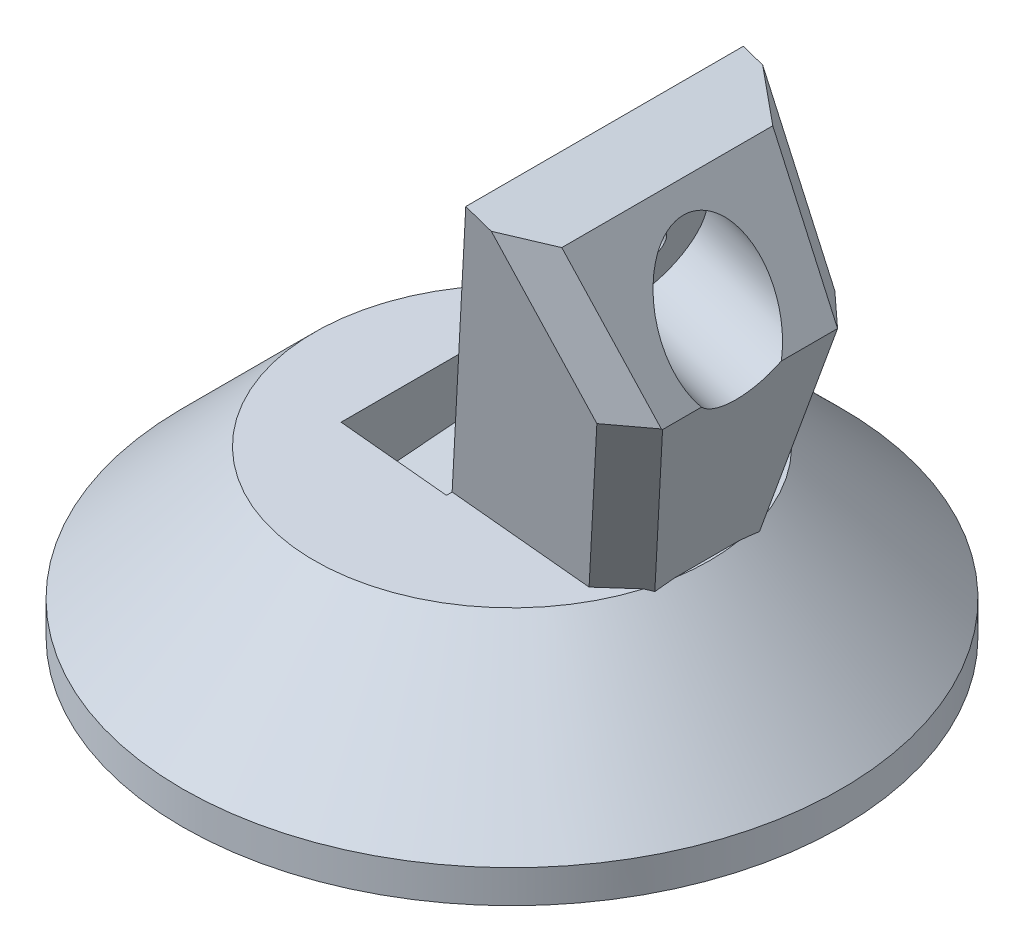
ISO-10303-21;
HEADER;
FILE_DESCRIPTION(('STEP AP214'),'2;1');
FILE_NAME('part.step','',(''),(''),'','','');
FILE_SCHEMA(('AUTOMOTIVE_DESIGN { 1 0 10303 214 1 1 1 1 }'));
ENDSEC;
DATA;
#1=APPLICATION_CONTEXT('core data for automotive mechanical design processes');
#2=APPLICATION_PROTOCOL_DEFINITION('international standard','automotive_design',2000,#1);
#3=PRODUCT_CONTEXT('',#1,'mechanical');
#4=PRODUCT('Part','Part','',(#3));
#5=PRODUCT_RELATED_PRODUCT_CATEGORY('part','',(#4));
#6=PRODUCT_DEFINITION_FORMATION('','',#4);
#7=PRODUCT_DEFINITION_CONTEXT('part definition',#1,'design');
#8=PRODUCT_DEFINITION('design','',#6,#7);
#9=PRODUCT_DEFINITION_SHAPE('','',#8);
#10=(LENGTH_UNIT() NAMED_UNIT(*) SI_UNIT(.MILLI.,.METRE.));
#11=(NAMED_UNIT(*) PLANE_ANGLE_UNIT() SI_UNIT($,.RADIAN.));
#12=(NAMED_UNIT(*) SI_UNIT($,.STERADIAN.) SOLID_ANGLE_UNIT());
#13=UNCERTAINTY_MEASURE_WITH_UNIT(LENGTH_MEASURE(1.E-05),#10,'distance_accuracy_value','');
#14=(GEOMETRIC_REPRESENTATION_CONTEXT(3) GLOBAL_UNCERTAINTY_ASSIGNED_CONTEXT((#13)) GLOBAL_UNIT_ASSIGNED_CONTEXT((#10,
#11,#12)) REPRESENTATION_CONTEXT('',''));
#15=CARTESIAN_POINT('',(0.,0.,0.));
#16=DIRECTION('',(0.,0.,1.));
#17=DIRECTION('',(1.,0.,0.));
#18=AXIS2_PLACEMENT_3D('',#15,#16,#17);
#19=CARTESIAN_POINT('',(-27.7596757204934,54.7423370391326,3.17601245662759));
#20=DIRECTION('',(0.946930129495105,-0.321439465303162,0.));
#21=DIRECTION('',(0.321439465303162,0.946930129495106,0.));
#22=AXIS2_PLACEMENT_3D('',#19,#20,#21);
#23=CYLINDRICAL_SURFACE('',#22,1.5);
#24=CARTESIAN_POINT('',(10.0065690125101,41.922424423238,3.17601245662759));
#25=DIRECTION('',(-0.946930129495105,0.321439465303162,0.));
#26=DIRECTION('',(-0.321439465303162,-0.946930129495106,0.));
#27=AXIS2_PLACEMENT_3D('',#24,#25,#26);
#28=CIRCLE('',#27,1.5);
#29=CARTESIAN_POINT('',(9.52440981455531,40.5020292289954,3.17601245662759));
#30=VERTEX_POINT('',#29);
#31=EDGE_CURVE('E415',#30,#30,#28,.T.);
#32=ORIENTED_EDGE('',*,*,#31,.T.);
#33=EDGE_LOOP('',(#32));
#34=FACE_BOUND('',#33,.T.);
#35=CARTESIAN_POINT('',(15.6881497894807,39.993787631419,3.17601245662759));
#36=DIRECTION('',(0.946930129495106,-0.321439465303162,0.));
#37=DIRECTION('',(0.321439465303162,0.946930129495105,0.));
#38=AXIS2_PLACEMENT_3D('',#35,#36,#37);
#39=CIRCLE('',#38,1.5);
#40=CARTESIAN_POINT('',(16.1703089874354,41.4141828256617,3.17601245662759));
#41=VERTEX_POINT('',#40);
#42=EDGE_CURVE('E413',#41,#41,#39,.F.);
#43=ORIENTED_EDGE('',*,*,#42,.F.);
#44=EDGE_LOOP('',(#43));
#45=FACE_BOUND('',#44,.T.);
#46=ADVANCED_FACE('F32',(#34,#45),#23,.F.);
#47=CARTESIAN_POINT('',(-18.,15.,0.));
#48=DIRECTION('',(0.,1.,0.));
#49=DIRECTION('',(0.,0.,1.));
#50=AXIS2_PLACEMENT_3D('',#47,#48,#49);
#51=PLANE('',#50);
#52=DIRECTION('',(-0.999934455038665,0.,0.0114492631434682));
#53=VECTOR('',#52,1.);
#54=CARTESIAN_POINT('',(-18.0856382371058,15.,-7.47931311193634));
#55=LINE('',#54,#53);
#56=CARTESIAN_POINT('',(14.5962110075819,15.,-7.85352073137787));
#57=VERTEX_POINT('',#56);
#58=CARTESIAN_POINT('',(0.867637383114527,15.,-7.69632837620003));
#59=VERTEX_POINT('',#58);
#60=EDGE_CURVE('E163',#57,#59,#55,.T.);
#61=ORIENTED_EDGE('',*,*,#60,.F.);
#62=DIRECTION('',(-0.730054006471106,0.,-0.68338945531482));
#63=VECTOR('',#62,1.);
#64=CARTESIAN_POINT('',(13.9186151586497,15.,-8.4878051185888));
#65=LINE('',#64,#63);
#66=CARTESIAN_POINT('',(17.1513905962115,15.,-5.46166646877923));
#67=VERTEX_POINT('',#66);
#68=EDGE_CURVE('E191',#57,#67,#65,.F.);
#69=ORIENTED_EDGE('',*,*,#68,.T.);
#70=CARTESIAN_POINT('',(0.,15.,0.));
#71=DIRECTION('',(0.,1.,0.));
#72=DIRECTION('',(0.,0.,1.));
#73=AXIS2_PLACEMENT_3D('',#70,#71,#72);
#74=CIRCLE('',#73,18.);
#75=CARTESIAN_POINT('',(17.2219620185472,15.,5.2348853121835));
#76=VERTEX_POINT('',#75);
#77=EDGE_CURVE('E54',#67,#76,#74,.T.);
#78=ORIENTED_EDGE('',*,*,#77,.T.);
#79=DIRECTION('',(0.745897481200364,0.,-0.666060768653246));
#80=VECTOR('',#79,1.);
#81=CARTESIAN_POINT('',(15.7204142178493,15.,6.57571579828868));
#82=LINE('',#81,#80);
#83=CARTESIAN_POINT('',(14.5962110075819,15.,7.57959055752248));
#84=VERTEX_POINT('',#83);
#85=EDGE_CURVE('E41',#76,#84,#82,.F.);
#86=ORIENTED_EDGE('',*,*,#85,.T.);
#87=DIRECTION('',(0.99580121253747,0.,0.0915420401176663));
#88=VECTOR('',#87,1.);
#89=CARTESIAN_POINT('',(-18.4177833902428,15.,4.54467921019736));
#90=LINE('',#89,#88);
#91=CARTESIAN_POINT('',(0.867637383114528,15.,6.31754987945689));
#92=VERTEX_POINT('',#91);
#93=EDGE_CURVE('E350',#92,#84,#90,.T.);
#94=ORIENTED_EDGE('',*,*,#93,.F.);
#95=DIRECTION('',(0.,0.,1.));
#96=VECTOR('',#95,1.);
#97=CARTESIAN_POINT('',(0.867637383114527,15.,0.));
#98=LINE('',#97,#96);
#99=CARTESIAN_POINT('',(0.867637383114526,15.,6.83759542695866));
#100=VERTEX_POINT('',#99);
#101=EDGE_CURVE('E343',#92,#100,#98,.T.);
#102=ORIENTED_EDGE('',*,*,#101,.T.);
#103=DIRECTION('',(0.99580121253747,0.,0.0915420401176663));
#104=VECTOR('',#103,1.);
#105=CARTESIAN_POINT('',(-18.4651895330117,15.,5.06036680455694));
#106=LINE('',#105,#104);
#107=CARTESIAN_POINT('',(-9.69280386647578,15.,5.86679490536974));
#108=VERTEX_POINT('',#107);
#109=EDGE_CURVE('E363',#108,#100,#106,.T.);
#110=ORIENTED_EDGE('',*,*,#109,.F.);
#111=DIRECTION('',(0.,0.,1.));
#112=VECTOR('',#111,1.);
#113=CARTESIAN_POINT('',(-9.69280386647578,15.,0.));
#114=LINE('',#113,#112);
#115=CARTESIAN_POINT('',(-9.69280386647578,15.,-8.09545672741115));
#116=VERTEX_POINT('',#115);
#117=EDGE_CURVE('E357',#116,#108,#114,.T.);
#118=ORIENTED_EDGE('',*,*,#117,.F.);
#119=DIRECTION('',(-0.999934455038665,0.,0.0114492631434682));
#120=VECTOR('',#119,1.);
#121=CARTESIAN_POINT('',(-18.091591985162,15.,-7.99929048894169));
#122=LINE('',#121,#120);
#123=CARTESIAN_POINT('',(0.867637383114527,15.,-8.2163739237018));
#124=VERTEX_POINT('',#123);
#125=EDGE_CURVE('E361',#124,#116,#122,.T.);
#126=ORIENTED_EDGE('',*,*,#125,.F.);
#127=EDGE_CURVE('E347',#124,#59,#98,.T.);
#128=ORIENTED_EDGE('',*,*,#127,.T.);
#129=EDGE_LOOP('',(#61,#69,#78,#86,#94,#102,#110,#118,#126,#128));
#130=FACE_BOUND('',#129,.T.);
#131=ADVANCED_FACE('F278',(#130),#51,.T.);
#132=CARTESIAN_POINT('',(0.,0.,0.));
#133=DIRECTION('',(0.,-1.,0.));
#134=DIRECTION('',(0.,0.,-1.));
#135=AXIS2_PLACEMENT_3D('',#132,#133,#134);
#136=PLANE('',#135);
#137=CARTESIAN_POINT('',(16.,0.,0.));
#138=DIRECTION('',(0.,-1.,0.));
#139=DIRECTION('',(0.,0.,-1.));
#140=AXIS2_PLACEMENT_3D('',#137,#138,#139);
#141=CIRCLE('',#140,1.75);
#142=CARTESIAN_POINT('',(16.,0.,-1.75));
#143=VERTEX_POINT('',#142);
#144=EDGE_CURVE('E319',#143,#143,#141,.T.);
#145=ORIENTED_EDGE('',*,*,#144,.F.);
#146=EDGE_LOOP('',(#145));
#147=FACE_BOUND('',#146,.T.);
#148=CARTESIAN_POINT('',(-16.,0.,0.));
#149=DIRECTION('',(0.,-1.,0.));
#150=DIRECTION('',(0.,0.,-1.));
#151=AXIS2_PLACEMENT_3D('',#148,#149,#150);
#152=CIRCLE('',#151,1.75);
#153=CARTESIAN_POINT('',(-16.,0.,-1.75));
#154=VERTEX_POINT('',#153);
#155=EDGE_CURVE('E310',#154,#154,#152,.T.);
#156=ORIENTED_EDGE('',*,*,#155,.F.);
#157=EDGE_LOOP('',(#156));
#158=FACE_BOUND('',#157,.T.);
#159=CARTESIAN_POINT('',(0.,0.,0.));
#160=DIRECTION('',(0.,1.,0.));
#161=DIRECTION('',(0.,0.,1.));
#162=AXIS2_PLACEMENT_3D('',#159,#160,#161);
#163=CIRCLE('',#162,30.);
#164=CARTESIAN_POINT('',(0.,0.,30.));
#165=VERTEX_POINT('',#164);
#166=EDGE_CURVE('E348',#165,#165,#163,.T.);
#167=ORIENTED_EDGE('',*,*,#166,.F.);
#168=EDGE_LOOP('',(#167));
#169=FACE_BOUND('',#168,.T.);
#170=ADVANCED_FACE('F284',(#147,#158,#169),#136,.T.);
#171=CARTESIAN_POINT('',(0.,15.,0.));
#172=DIRECTION('',(0.,1.,0.));
#173=DIRECTION('',(0.,0.,1.));
#174=AXIS2_PLACEMENT_3D('',#171,#172,#173);
#175=CYLINDRICAL_SURFACE('',#174,30.);
#176=ORIENTED_EDGE('',*,*,#166,.T.);
#177=EDGE_LOOP('',(#176));
#178=FACE_BOUND('',#177,.T.);
#179=CARTESIAN_POINT('',(0.,3.,0.));
#180=DIRECTION('',(0.,1.,0.));
#181=DIRECTION('',(0.,0.,1.));
#182=AXIS2_PLACEMENT_3D('',#179,#180,#181);
#183=CIRCLE('',#182,30.);
#184=CARTESIAN_POINT('',(0.,3.,30.));
#185=VERTEX_POINT('',#184);
#186=EDGE_CURVE('E368',#185,#185,#183,.T.);
#187=ORIENTED_EDGE('',*,*,#186,.F.);
#188=EDGE_LOOP('',(#187));
#189=FACE_BOUND('',#188,.T.);
#190=ADVANCED_FACE('F214',(#178,#189),#175,.T.);
#191=CARTESIAN_POINT('',(0.,15.,0.));
#192=DIRECTION('',(0.,-1.,0.));
#193=DIRECTION('',(0.,0.,-1.));
#194=AXIS2_PLACEMENT_3D('',#191,#192,#193);
#195=CONICAL_SURFACE('',#194,18.,0.78539816339745);
#196=CARTESIAN_POINT('',(16.0925530766064,10.0750645714377,16.3273512818325));
#197=CARTESIAN_POINT('',(16.1743657123231,10.3160768244306,15.9082564784611));
#198=CARTESIAN_POINT('',(16.2545727723403,10.5523592039352,15.4860846850062));
#199=CARTESIAN_POINT('',(16.4113090044216,11.0140892544172,14.6350154059007));
#200=CARTESIAN_POINT('',(16.4878370085888,11.2395334848812,14.206115841115));
#201=CARTESIAN_POINT('',(16.6370372036006,11.6790630860456,13.3393017745053));
#202=CARTESIAN_POINT('',(16.7096901204921,11.8930916775111,12.9013549709433));
#203=CARTESIAN_POINT('',(16.8501524625984,12.3068803940724,12.0181012953445));
#204=CARTESIAN_POINT('',(16.9179623373143,12.5066418433554,11.5727951110959));
#205=CARTESIAN_POINT('',(17.1103636528263,13.0734378416036,10.244580786781));
#206=CARTESIAN_POINT('',(17.2272362457449,13.4177333979765,9.35046633830621));
#207=CARTESIAN_POINT('',(17.3823847378484,13.874786117312,7.9882170158982));
#208=CARTESIAN_POINT('',(17.430707703959,14.0171409850118,7.5310257865221));
#209=CARTESIAN_POINT('',(17.5199280865168,14.2799757564962,6.60971195449791));
#210=CARTESIAN_POINT('',(17.5608268478918,14.4004596223107,6.14559062378861));
#211=CARTESIAN_POINT('',(17.6335962847623,14.6148314705653,5.22196807931709));
#212=CARTESIAN_POINT('',(17.6656553463128,14.7092744204281,4.76261174589229));
#213=CARTESIAN_POINT('',(17.7074909244413,14.8325180594047,4.06873116180376));
#214=CARTESIAN_POINT('',(17.7204193852108,14.8706040766868,3.83601762160133));
#215=CARTESIAN_POINT('',(17.7440794689754,14.9403044358569,3.36951245668766));
#216=CARTESIAN_POINT('',(17.754811086229,14.9719187608312,3.13572082916043));
#217=CARTESIAN_POINT('',(17.7644112733108,15.0002,2.90146379482268));
#218=B_SPLINE_CURVE_WITH_KNOTS('',3,(#196,#197,#198,#199,#200,#201,#202,#203,#204,#205,#206,
#207,#208,#209,#210,#211,#212,#213,#214,#215,#216,#217),.UNSPECIFIED.,.F.,.F.,(4,2,2,2,2,2,2,2,
2,2,4),(0.,1.47099772397933,2.94245936605079,4.42066322346395,5.8987297044391,8.79039829750672,
10.2337361395808,11.6768122530344,13.086217032091,13.7946183234912,14.5030214662946),.UNSPECIFIED.);
#219=CARTESIAN_POINT('',(17.6705046552463,14.7235600238837,4.66706796923942));
#220=VERTEX_POINT('',#219);
#221=CARTESIAN_POINT('',(17.764343382459,15.,2.90311973402459));
#222=VERTEX_POINT('',#221);
#223=EDGE_CURVE('E229',#220,#222,#218,.T.);
#224=ORIENTED_EDGE('',*,*,#223,.F.);
#225=CARTESIAN_POINT('',(17.6705046552467,14.7235600238852,4.66706796923994));
#226=CARTESIAN_POINT('',(17.5965648819781,14.7708929410682,4.76173656687664));
#227=CARTESIAN_POINT('',(17.5222164520292,14.8175960585582,4.85638896540984));
#228=CARTESIAN_POINT('',(17.3727022402175,14.9097427179127,5.0456614130744));
#229=CARTESIAN_POINT('',(17.2975364579333,14.9551862591277,5.14028146218906));
#230=CARTESIAN_POINT('',(17.2219620185473,15.,5.23488531218351));
#231=B_SPLINE_CURVE_WITH_KNOTS('',3,(#225,#226,#227,#228,#229,#230),.UNSPECIFIED.,.F.,.F.,(4,2,
4),(0.,0.387313207759773,0.774626615262219),.UNSPECIFIED.);
#232=EDGE_CURVE('E200',#220,#76,#231,.T.);
#233=ORIENTED_EDGE('',*,*,#232,.T.);
#234=ORIENTED_EDGE('',*,*,#77,.F.);
#235=CARTESIAN_POINT('',(17.1513905962115,15.,-5.46166646877924));
#236=CARTESIAN_POINT('',(17.2363760239892,14.9486671559689,-5.36387089394197));
#237=CARTESIAN_POINT('',(17.3209676669789,14.8965450700632,-5.26616345740996));
#238=CARTESIAN_POINT('',(17.4893633238102,14.7907224519389,-5.07092493002468));
#239=CARTESIAN_POINT('',(17.5731673382091,14.7370219208371,-4.9733938390467));
#240=CARTESIAN_POINT('',(17.6565775683773,14.6825321489776,-4.87595088624926));
#241=B_SPLINE_CURVE_WITH_KNOTS('',3,(#235,#236,#237,#238,#239,#240),.UNSPECIFIED.,.F.,.F.,(4,2,
4),(0.,0.418058380502809,0.836116465218344),.UNSPECIFIED.);
#242=CARTESIAN_POINT('',(17.6565775683773,14.6825321489776,-4.87595088624926));
#243=VERTEX_POINT('',#242);
#244=EDGE_CURVE('E193',#67,#243,#241,.T.);
#245=ORIENTED_EDGE('',*,*,#244,.T.);
#246=CARTESIAN_POINT('',(17.7644112733108,15.0002,-2.90146379482269));
#247=CARTESIAN_POINT('',(17.7538094403526,14.9689680072311,-3.16017374443213));
#248=CARTESIAN_POINT('',(17.7418271390909,14.9336692859782,-3.41831185686817));
#249=CARTESIAN_POINT('',(17.7151929502917,14.8552074959027,-3.93323023362946));
#250=CARTESIAN_POINT('',(17.700541292865,14.8120451049644,-4.19001061303562));
#251=CARTESIAN_POINT('',(17.6528249628675,14.6714773296264,-4.9563136798201));
#252=CARTESIAN_POINT('',(17.615925301368,14.5627744321489,-5.46356611740808));
#253=CARTESIAN_POINT('',(17.5327830992425,14.3178454028183,-6.47027993328461));
#254=CARTESIAN_POINT('',(17.4865442950401,14.1816302781143,-6.96974434161032));
#255=CARTESIAN_POINT('',(17.3855015906053,13.8839680694469,-7.96207567437167));
#256=CARTESIAN_POINT('',(17.3306696295711,13.7224383210275,-8.45491502843382));
#257=CARTESIAN_POINT('',(17.2720935842753,13.5498788560439,-8.94326538410898));
#258=B_SPLINE_CURVE_WITH_KNOTS('',3,(#246,#247,#248,#249,#250,#251,#252,#253,#254,#255,#256,
#257),.UNSPECIFIED.,.F.,.F.,(4,2,2,2,2,4),(0.,0.782332225327559,1.56459704192477,
3.1237886397926,4.68235766432573,6.24612649572785),.UNSPECIFIED.);
#259=CARTESIAN_POINT('',(17.764343382459,15.,-2.90311973402459));
#260=VERTEX_POINT('',#259);
#261=EDGE_CURVE('E221',#260,#243,#258,.T.);
#262=ORIENTED_EDGE('',*,*,#261,.F.);
#263=EDGE_CURVE('E371',#222,#260,#74,.T.);
#264=ORIENTED_EDGE('',*,*,#263,.F.);
#265=EDGE_LOOP('',(#224,#233,#234,#245,#262,#264));
#266=FACE_BOUND('',#265,.T.);
#267=ORIENTED_EDGE('',*,*,#186,.T.);
#268=EDGE_LOOP('',(#267));
#269=FACE_BOUND('',#268,.T.);
#270=ADVANCED_FACE('F208',(#266,#269),#195,.T.);
#271=DIRECTION('',(0.,0.,-1.));
#272=VECTOR('',#271,1.);
#273=CARTESIAN_POINT('',(17.764343382459,15.,0.));
#274=LINE('',#273,#272);
#275=EDGE_CURVE('E354',#222,#260,#274,.T.);
#276=ORIENTED_EDGE('',*,*,#275,.F.);
#277=ORIENTED_EDGE('',*,*,#263,.T.);
#278=EDGE_LOOP('',(#276,#277));
#279=FACE_BOUND('',#278,.T.);
#280=ADVANCED_FACE('F213',(#279),#51,.T.);
#281=CARTESIAN_POINT('',(-12.3371427862094,7.21002874264162,-7.80241819751683));
#282=DIRECTION('',(-0.0114427563092417,-0.033709273077193,-0.999366173250153));
#283=DIRECTION('',(0.,0.999431606516327,-0.0337114801839541));
#284=AXIS2_PLACEMENT_3D('',#281,#282,#283);
#285=PLANE('',#284);
#286=ORIENTED_EDGE('',*,*,#125,.T.);
#287=DIRECTION('',(0.321235728371597,0.946329939848795,-0.0355984797898093));
#288=VECTOR('',#287,1.);
#289=CARTESIAN_POINT('',(-12.3371427862094,7.21002874264162,-7.80241819751683));
#290=LINE('',#289,#288);
#291=CARTESIAN_POINT('',(-12.3371427862094,7.21002874264162,-7.80241819751683));
#292=VERTEX_POINT('',#291);
#293=EDGE_CURVE('E377',#292,#116,#290,.T.);
#294=ORIENTED_EDGE('',*,*,#293,.F.);
#295=DIRECTION('',(0.946930129495105,-0.321439465303162,0.));
#296=VECTOR('',#295,1.);
#297=CARTESIAN_POINT('',(-12.3371427862094,7.21002874264162,-7.80241819751683));
#298=LINE('',#297,#296);
#299=CARTESIAN_POINT('',(-2.86784149125832,3.99563408961,-7.80241819751683));
#300=VERTEX_POINT('',#299);
#301=EDGE_CURVE('E373',#292,#300,#298,.T.);
#302=ORIENTED_EDGE('',*,*,#301,.T.);
#303=DIRECTION('',(0.321235728371597,0.946329939848795,-0.0355984797898093));
#304=VECTOR('',#303,1.);
#305=CARTESIAN_POINT('',(-2.86784149125832,3.99563408961,-7.80241819751683));
#306=LINE('',#305,#304);
#307=EDGE_CURVE('E379',#300,#124,#306,.T.);
#308=ORIENTED_EDGE('',*,*,#307,.T.);
#309=EDGE_LOOP('',(#286,#294,#302,#308));
#310=FACE_BOUND('',#309,.T.);
#311=ADVANCED_FACE('F265',(#310),#285,.F.);
#312=CARTESIAN_POINT('',(-12.7986617499973,5.85043771752586,3.10347527759508));
#313=DIRECTION('',(-0.318689506117566,-0.93882901096796,-0.130526192220049));
#314=DIRECTION('',(0.946930129495106,-0.321439465303162,0.));
#315=AXIS2_PLACEMENT_3D('',#312,#313,#314);
#316=PLANE('',#315);
#317=DIRECTION('',(0.0419562694352702,0.123599184101434,-0.991444861373811));
#318=VECTOR('',#317,1.);
#319=CARTESIAN_POINT('',(-3.32936045504629,2.63604306449423,3.10347527759508));
#320=LINE('',#319,#318);
#321=CARTESIAN_POINT('',(-3.32936045504629,2.63604306449423,3.10347527759508));
#322=VERTEX_POINT('',#321);
#323=EDGE_CURVE('E382',#322,#300,#320,.T.);
#324=ORIENTED_EDGE('',*,*,#323,.T.);
#325=ORIENTED_EDGE('',*,*,#301,.F.);
#326=DIRECTION('',(0.0419562694352702,0.123599184101434,-0.991444861373811));
#327=VECTOR('',#326,1.);
#328=CARTESIAN_POINT('',(-12.7986617499973,5.85043771752586,3.10347527759508));
#329=LINE('',#328,#327);
#330=CARTESIAN_POINT('',(-12.7986617499973,5.85043771752586,3.10347527759508));
#331=VERTEX_POINT('',#330);
#332=EDGE_CURVE('E387',#331,#292,#329,.T.);
#333=ORIENTED_EDGE('',*,*,#332,.F.);
#334=DIRECTION('',(0.946930129495105,-0.321439465303162,0.));
#335=VECTOR('',#334,1.);
#336=CARTESIAN_POINT('',(-12.7986617499973,5.85043771752586,3.10347527759508));
#337=LINE('',#336,#335);
#338=EDGE_CURVE('E374',#331,#322,#337,.T.);
#339=ORIENTED_EDGE('',*,*,#338,.T.);
#340=EDGE_LOOP('',(#324,#325,#333,#339));
#341=FACE_BOUND('',#340,.T.);
#342=ADVANCED_FACE('F268',(#341),#316,.F.);
#343=CARTESIAN_POINT('',(-6.83149115798718,23.429155427507,8.41253970925067));
#344=DIRECTION('',(-0.0883845913149542,-0.260372609879457,0.961454246463475));
#345=DIRECTION('',(0.,-0.965231754320216,-0.2613956014395));
#346=AXIS2_PLACEMENT_3D('',#343,#344,#345);
#347=PLANE('',#346);
#348=ORIENTED_EDGE('',*,*,#109,.T.);
#349=DIRECTION('',(-0.309049338896674,-0.910429994107277,-0.27496496496345));
#350=VECTOR('',#349,1.);
#351=CARTESIAN_POINT('',(2.63781013696388,20.2147607744754,8.41253970925067));
#352=LINE('',#351,#350);
#353=EDGE_CURVE('E234',#100,#322,#352,.T.);
#354=ORIENTED_EDGE('',*,*,#353,.T.);
#355=ORIENTED_EDGE('',*,*,#338,.F.);
#356=DIRECTION('',(-0.309049338896674,-0.910429994107277,-0.27496496496345));
#357=VECTOR('',#356,1.);
#358=CARTESIAN_POINT('',(-6.83149115798718,23.429155427507,8.41253970925067));
#359=LINE('',#358,#357);
#360=EDGE_CURVE('E235',#108,#331,#359,.T.);
#361=ORIENTED_EDGE('',*,*,#360,.F.);
#362=EDGE_LOOP('',(#348,#354,#355,#361));
#363=FACE_BOUND('',#362,.T.);
#364=ADVANCED_FACE('F260',(#363),#347,.F.);
#365=CARTESIAN_POINT('',(-13.2570218129315,4.50015251424427,0.));
#366=DIRECTION('',(-0.946930129495105,0.321439465303162,0.));
#367=DIRECTION('',(-0.321439465303162,-0.946930129495106,0.));
#368=AXIS2_PLACEMENT_3D('',#365,#366,#367);
#369=PLANE('',#368);
#370=ORIENTED_EDGE('',*,*,#117,.T.);
#371=ORIENTED_EDGE('',*,*,#360,.T.);
#372=ORIENTED_EDGE('',*,*,#332,.T.);
#373=ORIENTED_EDGE('',*,*,#293,.T.);
#374=EDGE_LOOP('',(#370,#371,#372,#373));
#375=FACE_BOUND('',#374,.T.);
#376=ADVANCED_FACE('F257',(#375),#369,.F.);
#377=CARTESIAN_POINT('',(-3.78772051798042,1.28575786121265,0.));
#378=DIRECTION('',(-0.946930129495105,0.321439465303162,0.));
#379=DIRECTION('',(-0.321439465303162,-0.946930129495106,0.));
#380=AXIS2_PLACEMENT_3D('',#377,#378,#379);
#381=PLANE('',#380);
#382=ORIENTED_EDGE('',*,*,#31,.F.);
#383=EDGE_LOOP('',(#382));
#384=FACE_BOUND('',#383,.T.);
#385=ORIENTED_EDGE('',*,*,#307,.F.);
#386=ORIENTED_EDGE('',*,*,#323,.F.);
#387=ORIENTED_EDGE('',*,*,#353,.F.);
#388=ORIENTED_EDGE('',*,*,#101,.F.);
#389=DIRECTION('',(0.309049338896674,0.910429994107277,0.27496496496345));
#390=VECTOR('',#389,1.);
#391=CARTESIAN_POINT('',(12.1180186687252,48.1425545323287,16.3271512818325));
#392=LINE('',#391,#390);
#393=CARTESIAN_POINT('',(12.1180186687252,48.1425545323287,16.3271512818325));
#394=VERTEX_POINT('',#393);
#395=EDGE_CURVE('E322',#92,#394,#392,.T.);
#396=ORIENTED_EDGE('',*,*,#395,.T.);
#397=DIRECTION('',(0.,0.,-1.));
#398=VECTOR('',#397,1.);
#399=CARTESIAN_POINT('',(12.1180186687252,48.1425545323287,-8.94306538410898));
#400=LINE('',#399,#398);
#401=CARTESIAN_POINT('',(12.1180186687252,48.1425545323287,-8.94306538410898));
#402=VERTEX_POINT('',#401);
#403=EDGE_CURVE('E325',#394,#402,#400,.T.);
#404=ORIENTED_EDGE('',*,*,#403,.T.);
#405=DIRECTION('',(-0.321235728371597,-0.946329939848795,0.0355984797898091));
#406=VECTOR('',#405,1.);
#407=CARTESIAN_POINT('',(0.867637383114528,15.,-7.69632837620003));
#408=LINE('',#407,#406);
#409=EDGE_CURVE('E328',#402,#59,#408,.T.);
#410=ORIENTED_EDGE('',*,*,#409,.T.);
#411=ORIENTED_EDGE('',*,*,#127,.F.);
#412=EDGE_LOOP('',(#385,#386,#387,#388,#396,#404,#410,#411));
#413=FACE_BOUND('',#412,.T.);
#414=ADVANCED_FACE('F249',(#384,#413),#381,.T.);
#415=CARTESIAN_POINT('',(16.0185194550362,9.8569685551494,-7.69632837620003));
#416=DIRECTION('',(-0.0114427563092417,-0.0337092730771928,-0.999366173250153));
#417=DIRECTION('',(0.,0.999431606516327,-0.0337114801839539));
#418=AXIS2_PLACEMENT_3D('',#415,#416,#417);
#419=PLANE('',#418);
#420=DIRECTION('',(-0.946930129495105,0.321439465303162,0.));
#421=VECTOR('',#420,1.);
#422=CARTESIAN_POINT('',(27.2689007406469,42.9995230874781,-8.94306538410898));
#423=LINE('',#422,#421);
#424=CARTESIAN_POINT('',(13.8807903903369,47.5441741640237,-8.94306538410898));
#425=VERTEX_POINT('',#424);
#426=EDGE_CURVE('E332',#425,#402,#423,.T.);
#427=ORIENTED_EDGE('',*,*,#426,.F.);
#428=DIRECTION('',(0.44214845636508,-0.896588375407576,0.0251799050431326));
#429=VECTOR('',#428,1.);
#430=CARTESIAN_POINT('',(29.252743273097,16.3729373009558,-8.0676482966052));
#431=LINE('',#430,#429);
#432=CARTESIAN_POINT('',(20.8477776715255,33.4165215215628,-8.5463025420101));
#433=VERTEX_POINT('',#432);
#434=EDGE_CURVE('E168',#425,#433,#431,.T.);
#435=ORIENTED_EDGE('',*,*,#434,.T.);
#436=DIRECTION('',(-0.321235728371597,-0.946329939848795,0.0355984797898091));
#437=VECTOR('',#436,1.);
#438=CARTESIAN_POINT('',(13.1777290665509,10.8212869510589,-7.69632837620003));
#439=LINE('',#438,#437);
#440=EDGE_CURVE('E161',#433,#57,#439,.T.);
#441=ORIENTED_EDGE('',*,*,#440,.T.);
#442=ORIENTED_EDGE('',*,*,#60,.T.);
#443=ORIENTED_EDGE('',*,*,#409,.F.);
#444=EDGE_LOOP('',(#427,#435,#441,#442,#443));
#445=FACE_BOUND('',#444,.T.);
#446=ADVANCED_FACE('F244',(#445),#419,.T.);
#447=CARTESIAN_POINT('',(27.2689007406469,42.9995230874781,-8.94306538410898));
#448=DIRECTION('',(0.321439465303162,0.946930129495105,0.));
#449=DIRECTION('',(-0.946930129495106,0.321439465303162,0.));
#450=AXIS2_PLACEMENT_3D('',#447,#448,#449);
#451=PLANE('',#450);
#452=DIRECTION('',(0.,0.,-1.));
#453=VECTOR('',#452,1.);
#454=CARTESIAN_POINT('',(17.7995994456959,46.2139177405097,-8.94306538410898));
#455=LINE('',#454,#453);
#456=CARTESIAN_POINT('',(17.7995994456959,46.2139177405097,13.2664238051408));
#457=VERTEX_POINT('',#456);
#458=CARTESIAN_POINT('',(17.7995994456959,46.2139177405097,-5.94211389020302));
#459=VERTEX_POINT('',#458);
#460=EDGE_CURVE('E159',#457,#459,#455,.T.);
#461=ORIENTED_EDGE('',*,*,#460,.T.);
#462=DIRECTION('',(-0.766592941916583,0.260223238948189,-0.587042696330507));
#463=VECTOR('',#462,1.);
#464=CARTESIAN_POINT('',(22.6551018353263,44.5656967754284,-2.22385996560843));
#465=LINE('',#464,#463);
#466=EDGE_CURVE('E180',#459,#425,#465,.T.);
#467=ORIENTED_EDGE('',*,*,#466,.T.);
#468=ORIENTED_EDGE('',*,*,#426,.T.);
#469=ORIENTED_EDGE('',*,*,#403,.F.);
#470=DIRECTION('',(-0.946930129495105,0.321439465303162,0.));
#471=VECTOR('',#470,1.);
#472=CARTESIAN_POINT('',(27.2689007406469,42.9995230874781,16.3271512818325));
#473=LINE('',#472,#471);
#474=CARTESIAN_POINT('',(14.4467005444596,47.3520735520727,16.3271512818325));
#475=VERTEX_POINT('',#474);
#476=EDGE_CURVE('E331',#475,#394,#473,.T.);
#477=ORIENTED_EDGE('',*,*,#476,.F.);
#478=DIRECTION('',(0.716382617046374,-0.243179130332083,-0.653957075475692));
#479=VECTOR('',#478,1.);
#480=CARTESIAN_POINT('',(33.6240395173622,40.8422441640543,-1.17907543515884));
#481=LINE('',#480,#479);
#482=EDGE_CURVE('E178',#475,#457,#481,.T.);
#483=ORIENTED_EDGE('',*,*,#482,.T.);
#484=EDGE_LOOP('',(#461,#467,#468,#469,#477,#483));
#485=FACE_BOUND('',#484,.T.);
#486=ADVANCED_FACE('F248',(#485),#451,.T.);
#487=CARTESIAN_POINT('',(27.2689007406469,42.9995230874781,16.3271512818325));
#488=DIRECTION('',(-0.0883845913149541,-0.260372609879457,0.961454246463475));
#489=DIRECTION('',(0.,-0.965231754320216,-0.2613956014395));
#490=AXIS2_PLACEMENT_3D('',#487,#488,#489);
#491=PLANE('',#490);
#492=DIRECTION('',(0.309049338896674,0.910429994107278,0.27496496496345));
#493=VECTOR('',#492,1.);
#494=CARTESIAN_POINT('',(24.4281103521616,43.9638414833876,16.3271512818325));
#495=LINE('',#494,#493);
#496=CARTESIAN_POINT('',(21.0398782834764,33.9824316756855,13.3125998986129));
#497=VERTEX_POINT('',#496);
#498=EDGE_CURVE('E182',#84,#497,#495,.T.);
#499=ORIENTED_EDGE('',*,*,#498,.T.);
#500=DIRECTION('',(-0.433513300599761,0.879078011710579,0.198212178056941));
#501=VECTOR('',#500,1.);
#502=CARTESIAN_POINT('',(18.5151473249504,39.1020796035683,14.4669645319584));
#503=LINE('',#502,#501);
#504=EDGE_CURVE('E184',#497,#475,#503,.T.);
#505=ORIENTED_EDGE('',*,*,#504,.T.);
#506=ORIENTED_EDGE('',*,*,#476,.T.);
#507=ORIENTED_EDGE('',*,*,#395,.F.);
#508=ORIENTED_EDGE('',*,*,#93,.T.);
#509=EDGE_LOOP('',(#499,#505,#506,#507,#508));
#510=FACE_BOUND('',#509,.T.);
#511=ADVANCED_FACE('F241',(#510),#491,.T.);
#512=CARTESIAN_POINT('',(11.3631615539413,-3.85727358363795,0.));
#513=DIRECTION('',(0.946930129495105,-0.321439465303162,0.));
#514=DIRECTION('',(0.321439465303162,0.946930129495106,0.));
#515=AXIS2_PLACEMENT_3D('',#512,#513,#514);
#516=PLANE('',#515);
#517=CARTESIAN_POINT('',(25.1574510844318,36.7793929783874,3.17601245662759));
#518=DIRECTION('',(0.946930129495106,-0.321439465303162,0.));
#519=DIRECTION('',(0.321439465303162,0.946930129495105,0.));
#520=AXIS2_PLACEMENT_3D('',#517,#518,#519);
#521=CIRCLE('',#520,5.);
#522=CARTESIAN_POINT('',(24.0545060876153,33.530221792527,6.81282410132022));
#523=VERTEX_POINT('',#522);
#524=CARTESIAN_POINT('',(24.0545060876153,33.530221792527,-0.460799188065035));
#525=VERTEX_POINT('',#524);
#526=EDGE_CURVE('E46',#523,#525,#521,.T.);
#527=ORIENTED_EDGE('',*,*,#526,.F.);
#528=DIRECTION('',(0.,0.,1.));
#529=VECTOR('',#528,1.);
#530=CARTESIAN_POINT('',(24.0545060876153,33.530221792527,0.));
#531=LINE('',#530,#529);
#532=CARTESIAN_POINT('',(24.0545060876153,33.530221792527,10.3469918818574));
#533=VERTEX_POINT('',#532);
#534=EDGE_CURVE('E150',#523,#533,#531,.T.);
#535=ORIENTED_EDGE('',*,*,#534,.T.);
#536=DIRECTION('',(-0.309049338896674,-0.910429994107278,-0.27496496496345));
#537=VECTOR('',#536,1.);
#538=CARTESIAN_POINT('',(11.4434359543744,-3.62079282566521,-0.873230978731039));
#539=LINE('',#538,#537);
#540=EDGE_CURVE('E187',#533,#220,#539,.T.);
#541=ORIENTED_EDGE('',*,*,#540,.T.);
#542=ORIENTED_EDGE('',*,*,#223,.T.);
#543=ORIENTED_EDGE('',*,*,#275,.T.);
#544=ORIENTED_EDGE('',*,*,#261,.T.);
#545=DIRECTION('',(0.321235728371597,0.946329939848795,-0.0355984797898091));
#546=VECTOR('',#545,1.);
#547=CARTESIAN_POINT('',(11.3153779426469,-3.99803956328519,-4.17323619176615));
#548=LINE('',#547,#546);
#549=CARTESIAN_POINT('',(24.0545060876153,33.530221792527,-5.58495212419772));
#550=VERTEX_POINT('',#549);
#551=EDGE_CURVE('E189',#243,#550,#548,.T.);
#552=ORIENTED_EDGE('',*,*,#551,.T.);
#553=EDGE_CURVE('E152',#550,#525,#531,.T.);
#554=ORIENTED_EDGE('',*,*,#553,.T.);
#555=EDGE_LOOP('',(#527,#535,#541,#542,#543,#544,#552,#554));
#556=FACE_BOUND('',#555,.T.);
#557=ADVANCED_FACE('F149',(#556),#516,.T.);
#558=CARTESIAN_POINT('',(17.7995994456959,46.2139177405097,-8.94306538410898));
#559=DIRECTION('',(-0.89687274153269,-0.442288690218998,0.));
#560=DIRECTION('',(0.,0.,-1.));
#561=AXIS2_PLACEMENT_3D('',#558,#559,#560);
#562=PLANE('',#561);
#563=CARTESIAN_POINT('',(21.9082798985714,37.8823379752039,3.17601245662759));
#564=DIRECTION('',(-0.89687274153269,-0.442288690218998,0.));
#565=DIRECTION('',(0.442288690218998,-0.89687274153269,0.));
#566=AXIS2_PLACEMENT_3D('',#563,#564,#565);
#567=ELLIPSE('',#566,7.07106781186545,5.);
#568=EDGE_CURVE('E11',#525,#523,#567,.F.);
#569=ORIENTED_EDGE('',*,*,#568,.F.);
#570=ORIENTED_EDGE('',*,*,#553,.F.);
#571=DIRECTION('',(-0.356764194634613,0.723446220531241,-0.591054037652886));
#572=VECTOR('',#571,1.);
#573=CARTESIAN_POINT('',(19.2766040348155,43.2188487179576,-13.5005399053919));
#574=LINE('',#573,#572);
#575=CARTESIAN_POINT('',(24.0539115028039,33.5314274912519,-5.58593717751521));
#576=VERTEX_POINT('',#575);
#577=EDGE_CURVE('E174',#550,#576,#574,.T.);
#578=ORIENTED_EDGE('',*,*,#577,.T.);
#579=DIRECTION('',(0.44214845636508,-0.896588375407576,0.0251799050431326));
#580=VECTOR('',#579,1.);
#581=CARTESIAN_POINT('',(17.7661890840318,46.2816672519124,-5.94401657633037));
#582=LINE('',#581,#580);
#583=EDGE_CURVE('E176',#576,#459,#582,.F.);
#584=ORIENTED_EDGE('',*,*,#583,.T.);
#585=ORIENTED_EDGE('',*,*,#460,.F.);
#586=DIRECTION('',(-0.433513300599761,0.879078011710579,0.198212178056941));
#587=VECTOR('',#586,1.);
#588=CARTESIAN_POINT('',(19.7080078938348,42.3440482306223,12.393855894065));
#589=LINE('',#588,#587);
#590=CARTESIAN_POINT('',(24.0186963903934,33.602836675139,10.4229107012744));
#591=VERTEX_POINT('',#590);
#592=EDGE_CURVE('E172',#457,#591,#589,.F.);
#593=ORIENTED_EDGE('',*,*,#592,.T.);
#594=DIRECTION('',(0.322637083625423,-0.654243285235187,-0.684010991135633));
#595=VECTOR('',#594,1.);
#596=CARTESIAN_POINT('',(24.9831599700686,31.6470980050331,8.37818700852687));
#597=LINE('',#596,#595);
#598=EDGE_CURVE('E157',#591,#533,#597,.T.);
#599=ORIENTED_EDGE('',*,*,#598,.T.);
#600=ORIENTED_EDGE('',*,*,#534,.F.);
#601=EDGE_LOOP('',(#569,#570,#578,#584,#585,#593,#599,#600));
#602=FACE_BOUND('',#601,.T.);
#603=ADVANCED_FACE('F155',(#602),#562,.F.);
#604=CARTESIAN_POINT('',(13.1777290665509,10.8212869510589,-7.69632837620003));
#605=DIRECTION('',(-0.661489465294118,0.251128081238597,0.70665859799363));
#606=DIRECTION('',(-0.321235728371597,-0.946329939848795,0.0355984797898091));
#607=AXIS2_PLACEMENT_3D('',#604,#605,#606);
#608=PLANE('',#607);
#609=ORIENTED_EDGE('',*,*,#68,.F.);
#610=ORIENTED_EDGE('',*,*,#440,.F.);
#611=DIRECTION('',(-0.734450963651825,-0.0263222948911875,-0.67815110320825));
#612=VECTOR('',#611,1.);
#613=CARTESIAN_POINT('',(16.696938375132,33.2677578580742,-12.3789563029817));
#614=LINE('',#613,#612);
#615=EDGE_CURVE('E313',#576,#433,#614,.T.);
#616=ORIENTED_EDGE('',*,*,#615,.F.);
#617=ORIENTED_EDGE('',*,*,#577,.F.);
#618=ORIENTED_EDGE('',*,*,#551,.F.);
#619=ORIENTED_EDGE('',*,*,#244,.F.);
#620=EDGE_LOOP('',(#609,#610,#616,#617,#618,#619));
#621=FACE_BOUND('',#620,.T.);
#622=ADVANCED_FACE('F205',(#621),#608,.F.);
#623=CARTESIAN_POINT('',(29.252743273097,16.3729373009558,-8.0676482966052));
#624=DIRECTION('',(0.642059695163994,0.296776619117661,-0.70688258302989));
#625=DIRECTION('',(-0.44214845636508,0.896588375407576,-0.0251799050431326));
#626=AXIS2_PLACEMENT_3D('',#623,#624,#625);
#627=PLANE('',#626);
#628=ORIENTED_EDGE('',*,*,#466,.F.);
#629=ORIENTED_EDGE('',*,*,#583,.F.);
#630=ORIENTED_EDGE('',*,*,#615,.T.);
#631=ORIENTED_EDGE('',*,*,#434,.F.);
#632=EDGE_LOOP('',(#628,#629,#630,#631));
#633=FACE_BOUND('',#632,.T.);
#634=ADVANCED_FACE('F507',(#633),#627,.T.);
#635=CARTESIAN_POINT('',(24.4281103521616,43.9638414833876,16.3271512818325));
#636=DIRECTION('',(-0.607083372004641,0.411403263737848,-0.679850817474924));
#637=DIRECTION('',(0.309049338896674,0.910429994107278,0.27496496496345));
#638=AXIS2_PLACEMENT_3D('',#635,#636,#637);
#639=PLANE('',#638);
#640=ORIENTED_EDGE('',*,*,#540,.F.);
#641=ORIENTED_EDGE('',*,*,#598,.F.);
#642=DIRECTION('',(0.714779624203193,-0.0910853775227302,-0.693392776732989));
#643=VECTOR('',#642,1.);
#644=CARTESIAN_POINT('',(20.6270291563553,34.0350416233259,13.71309620955));
#645=LINE('',#644,#643);
#646=EDGE_CURVE('E309',#497,#591,#645,.T.);
#647=ORIENTED_EDGE('',*,*,#646,.F.);
#648=ORIENTED_EDGE('',*,*,#498,.F.);
#649=ORIENTED_EDGE('',*,*,#85,.F.);
#650=ORIENTED_EDGE('',*,*,#232,.F.);
#651=EDGE_LOOP('',(#640,#641,#647,#648,#649,#650));
#652=FACE_BOUND('',#651,.T.);
#653=ADVANCED_FACE('F34',(#652),#639,.F.);
#654=CARTESIAN_POINT('',(18.5151473249504,39.1020796035683,14.4669645319584));
#655=DIRECTION('',(0.696174730851019,0.187042182112888,0.693077171918799));
#656=DIRECTION('',(0.433513300599761,-0.879078011710579,-0.198212178056941));
#657=AXIS2_PLACEMENT_3D('',#654,#655,#656);
#658=PLANE('',#657);
#659=ORIENTED_EDGE('',*,*,#646,.T.);
#660=ORIENTED_EDGE('',*,*,#592,.F.);
#661=ORIENTED_EDGE('',*,*,#482,.F.);
#662=ORIENTED_EDGE('',*,*,#504,.F.);
#663=EDGE_LOOP('',(#659,#660,#661,#662));
#664=FACE_BOUND('',#663,.T.);
#665=ADVANCED_FACE('F304',(#664),#658,.T.);
#666=CARTESIAN_POINT('',(-16.,11.,0.));
#667=DIRECTION('',(0.,-1.,0.));
#668=DIRECTION('',(0.,0.,-1.));
#669=AXIS2_PLACEMENT_3D('',#666,#667,#668);
#670=CYLINDRICAL_SURFACE('',#669,1.75);
#671=CARTESIAN_POINT('',(-16.,11.,0.));
#672=DIRECTION('',(0.,-1.,0.));
#673=DIRECTION('',(0.,0.,-1.));
#674=AXIS2_PLACEMENT_3D('',#671,#672,#673);
#675=CIRCLE('',#674,1.75);
#676=CARTESIAN_POINT('',(-16.,11.,-1.75));
#677=VERTEX_POINT('',#676);
#678=EDGE_CURVE('E308',#677,#677,#675,.T.);
#679=ORIENTED_EDGE('',*,*,#678,.F.);
#680=EDGE_LOOP('',(#679));
#681=FACE_BOUND('',#680,.T.);
#682=ORIENTED_EDGE('',*,*,#155,.T.);
#683=EDGE_LOOP('',(#682));
#684=FACE_BOUND('',#683,.T.);
#685=ADVANCED_FACE('F242',(#681,#684),#670,.F.);
#686=CARTESIAN_POINT('',(-16.,11.,0.));
#687=DIRECTION('',(0.,-1.,0.));
#688=DIRECTION('',(0.,0.,-1.));
#689=AXIS2_PLACEMENT_3D('',#686,#687,#688);
#690=PLANE('',#689);
#691=ORIENTED_EDGE('',*,*,#678,.T.);
#692=EDGE_LOOP('',(#691));
#693=FACE_BOUND('',#692,.T.);
#694=ADVANCED_FACE('F297',(#693),#690,.T.);
#695=CARTESIAN_POINT('',(16.,11.,0.));
#696=DIRECTION('',(0.,-1.,0.));
#697=DIRECTION('',(0.,0.,-1.));
#698=AXIS2_PLACEMENT_3D('',#695,#696,#697);
#699=CYLINDRICAL_SURFACE('',#698,1.75);
#700=CARTESIAN_POINT('',(16.,11.,0.));
#701=DIRECTION('',(0.,-1.,0.));
#702=DIRECTION('',(0.,0.,-1.));
#703=AXIS2_PLACEMENT_3D('',#700,#701,#702);
#704=CIRCLE('',#703,1.75);
#705=CARTESIAN_POINT('',(16.,11.,-1.75));
#706=VERTEX_POINT('',#705);
#707=EDGE_CURVE('E316',#706,#706,#704,.T.);
#708=ORIENTED_EDGE('',*,*,#707,.F.);
#709=EDGE_LOOP('',(#708));
#710=FACE_BOUND('',#709,.T.);
#711=ORIENTED_EDGE('',*,*,#144,.T.);
#712=EDGE_LOOP('',(#711));
#713=FACE_BOUND('',#712,.T.);
#714=ADVANCED_FACE('F294',(#710,#713),#699,.F.);
#715=CARTESIAN_POINT('',(16.,11.,0.));
#716=DIRECTION('',(0.,-1.,0.));
#717=DIRECTION('',(0.,0.,-1.));
#718=AXIS2_PLACEMENT_3D('',#715,#716,#717);
#719=PLANE('',#718);
#720=ORIENTED_EDGE('',*,*,#707,.T.);
#721=EDGE_LOOP('',(#720));
#722=FACE_BOUND('',#721,.T.);
#723=ADVANCED_FACE('F290',(#722),#719,.T.);
#724=CARTESIAN_POINT('',(15.6881497894807,39.993787631419,3.17601245662759));
#725=DIRECTION('',(0.946930129495106,-0.321439465303162,0.));
#726=DIRECTION('',(0.321439465303162,0.946930129495105,0.));
#727=AXIS2_PLACEMENT_3D('',#724,#725,#726);
#728=PLANE('',#727);
#729=CARTESIAN_POINT('',(15.6881497894807,39.993787631419,3.17601245662759));
#730=DIRECTION('',(0.946930129495106,-0.321439465303162,0.));
#731=DIRECTION('',(0.321439465303162,0.946930129495105,0.));
#732=AXIS2_PLACEMENT_3D('',#729,#730,#731);
#733=CIRCLE('',#732,5.);
#734=CARTESIAN_POINT('',(17.2953471159965,44.7284382788946,3.17601245662759));
#735=VERTEX_POINT('',#734);
#736=EDGE_CURVE('E153',#735,#735,#733,.T.);
#737=ORIENTED_EDGE('',*,*,#736,.T.);
#738=EDGE_LOOP('',(#737));
#739=FACE_BOUND('',#738,.T.);
#740=ORIENTED_EDGE('',*,*,#42,.T.);
#741=EDGE_LOOP('',(#740));
#742=FACE_BOUND('',#741,.T.);
#743=ADVANCED_FACE('F293',(#739,#742),#728,.T.);
#744=CARTESIAN_POINT('',(15.6881497894807,39.993787631419,3.17601245662759));
#745=DIRECTION('',(0.946930129495105,-0.321439465303162,0.));
#746=DIRECTION('',(0.321439465303162,0.946930129495105,0.));
#747=AXIS2_PLACEMENT_3D('',#744,#745,#746);
#748=CYLINDRICAL_SURFACE('',#747,5.);
#749=ORIENTED_EDGE('',*,*,#568,.T.);
#750=ORIENTED_EDGE('',*,*,#526,.T.);
#751=EDGE_LOOP('',(#749,#750));
#752=FACE_BOUND('',#751,.T.);
#753=ORIENTED_EDGE('',*,*,#736,.F.);
#754=EDGE_LOOP('',(#753));
#755=FACE_BOUND('',#754,.T.);
#756=ADVANCED_FACE('F142',(#752,#755),#748,.F.);
#757=CLOSED_SHELL('',(#46,#131,#170,#190,#270,#280,#311,#342,#364,#376,#414,#446,#486,#511,#557,
#603,#622,#634,#653,#665,#685,#694,#714,#723,#743,#756));
#758=MANIFOLD_SOLID_BREP('B2',#757);
#759=ADVANCED_BREP_SHAPE_REPRESENTATION('',(#18,#758),#14);
#760=SHAPE_DEFINITION_REPRESENTATION(#9,#759);
ENDSEC;
END-ISO-10303-21;
